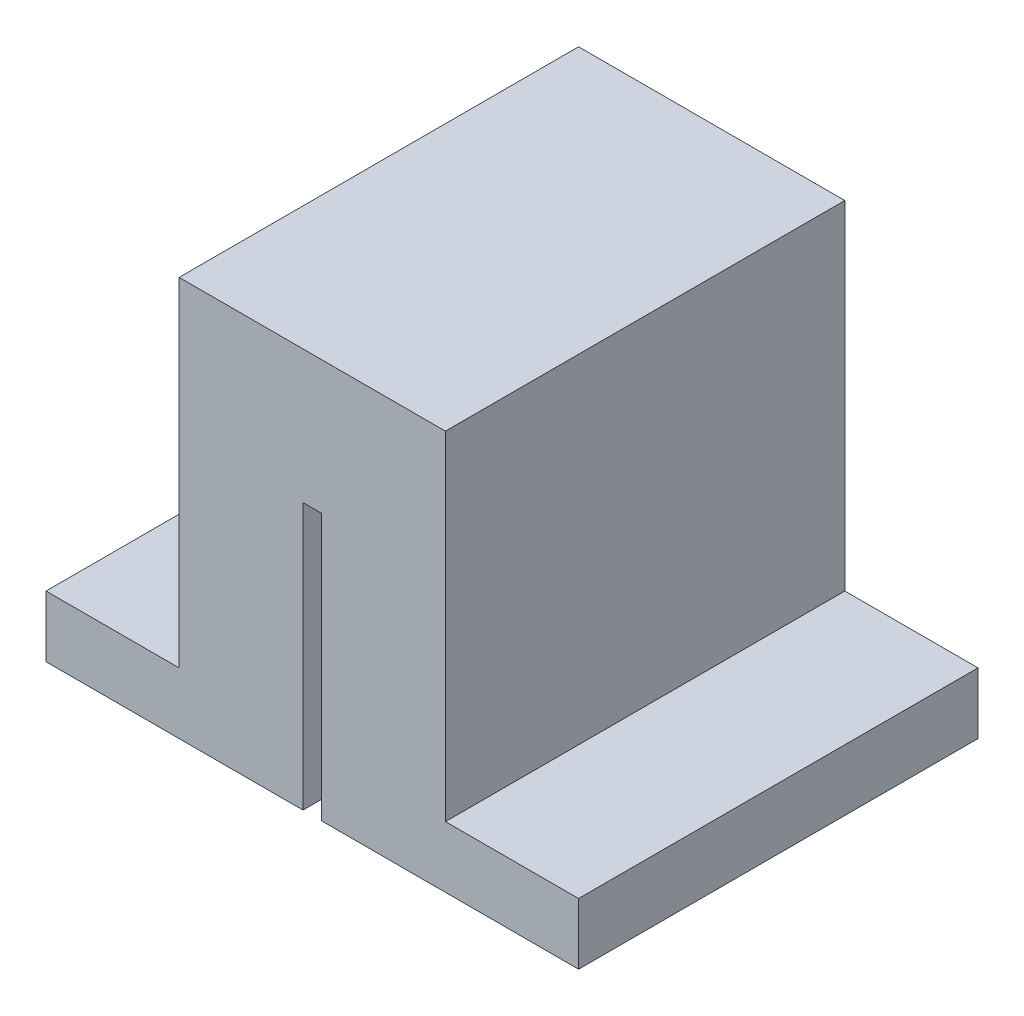
ISO-10303-21;
HEADER;
FILE_DESCRIPTION(('STEP AP214'),'2;1');
FILE_NAME('part.step','',(''),(''),'','','');
FILE_SCHEMA(('AUTOMOTIVE_DESIGN { 1 0 10303 214 1 1 1 1 }'));
ENDSEC;
DATA;
#1=APPLICATION_CONTEXT('core data for automotive mechanical design processes');
#2=APPLICATION_PROTOCOL_DEFINITION('international standard','automotive_design',2000,#1);
#3=PRODUCT_CONTEXT('',#1,'mechanical');
#4=PRODUCT('Part','Part','',(#3));
#5=PRODUCT_RELATED_PRODUCT_CATEGORY('part','',(#4));
#6=PRODUCT_DEFINITION_FORMATION('','',#4);
#7=PRODUCT_DEFINITION_CONTEXT('part definition',#1,'design');
#8=PRODUCT_DEFINITION('design','',#6,#7);
#9=PRODUCT_DEFINITION_SHAPE('','',#8);
#10=(LENGTH_UNIT() NAMED_UNIT(*) SI_UNIT(.MILLI.,.METRE.));
#11=(NAMED_UNIT(*) PLANE_ANGLE_UNIT() SI_UNIT($,.RADIAN.));
#12=(NAMED_UNIT(*) SI_UNIT($,.STERADIAN.) SOLID_ANGLE_UNIT());
#13=UNCERTAINTY_MEASURE_WITH_UNIT(LENGTH_MEASURE(1.E-05),#10,'distance_accuracy_value','');
#14=(GEOMETRIC_REPRESENTATION_CONTEXT(3) GLOBAL_UNCERTAINTY_ASSIGNED_CONTEXT((#13)) GLOBAL_UNIT_ASSIGNED_CONTEXT((#10,
#11,#12)) REPRESENTATION_CONTEXT('',''));
#15=CARTESIAN_POINT('',(0.,0.,0.));
#16=DIRECTION('',(0.,0.,1.));
#17=DIRECTION('',(1.,0.,0.));
#18=AXIS2_PLACEMENT_3D('',#15,#16,#17);
#19=CARTESIAN_POINT('',(5.,7.5,15.));
#20=DIRECTION('',(-1.,0.,0.));
#21=DIRECTION('',(0.,0.,1.));
#22=AXIS2_PLACEMENT_3D('',#19,#20,#21);
#23=PLANE('',#22);
#24=DIRECTION('',(0.,0.,1.));
#25=VECTOR('',#24,1.);
#26=CARTESIAN_POINT('',(5.,-5.2,-5.5036351623268));
#27=LINE('',#26,#25);
#28=CARTESIAN_POINT('',(5.,-5.2,0.));
#29=VERTEX_POINT('',#28);
#30=CARTESIAN_POINT('',(5.,-5.2,15.));
#31=VERTEX_POINT('',#30);
#32=EDGE_CURVE('E53',#29,#31,#27,.T.);
#33=ORIENTED_EDGE('',*,*,#32,.F.);
#34=DIRECTION('',(0.,1.,0.));
#35=VECTOR('',#34,1.);
#36=CARTESIAN_POINT('',(5.,7.5,0.));
#37=LINE('',#36,#35);
#38=CARTESIAN_POINT('',(5.,7.5,0.));
#39=VERTEX_POINT('',#38);
#40=EDGE_CURVE('E136',#29,#39,#37,.T.);
#41=ORIENTED_EDGE('',*,*,#40,.T.);
#42=DIRECTION('',(0.,0.,-1.));
#43=VECTOR('',#42,1.);
#44=CARTESIAN_POINT('',(5.,7.5,15.));
#45=LINE('',#44,#43);
#46=CARTESIAN_POINT('',(5.,7.5,15.));
#47=VERTEX_POINT('',#46);
#48=EDGE_CURVE('E11',#47,#39,#45,.T.);
#49=ORIENTED_EDGE('',*,*,#48,.F.);
#50=DIRECTION('',(0.,1.,0.));
#51=VECTOR('',#50,1.);
#52=CARTESIAN_POINT('',(5.,7.5,15.));
#53=LINE('',#52,#51);
#54=EDGE_CURVE('E199',#31,#47,#53,.T.);
#55=ORIENTED_EDGE('',*,*,#54,.F.);
#56=EDGE_LOOP('',(#33,#41,#49,#55));
#57=FACE_BOUND('',#56,.T.);
#58=ADVANCED_FACE('F39',(#57),#23,.F.);
#59=CARTESIAN_POINT('',(-5.,-7.5,15.));
#60=DIRECTION('',(0.,1.,0.));
#61=DIRECTION('',(0.,0.,1.));
#62=AXIS2_PLACEMENT_3D('',#59,#60,#61);
#63=PLANE('',#62);
#64=DIRECTION('',(1.,0.,0.));
#65=VECTOR('',#64,1.);
#66=CARTESIAN_POINT('',(-5.,-7.5,0.));
#67=LINE('',#66,#65);
#68=CARTESIAN_POINT('',(-10.,-7.5,0.));
#69=VERTEX_POINT('',#68);
#70=CARTESIAN_POINT('',(-0.35,-7.5,0.));
#71=VERTEX_POINT('',#70);
#72=EDGE_CURVE('E202',#69,#71,#67,.T.);
#73=ORIENTED_EDGE('',*,*,#72,.T.);
#74=DIRECTION('',(0.,0.,1.));
#75=VECTOR('',#74,1.);
#76=CARTESIAN_POINT('',(-0.35,-7.5,0.));
#77=LINE('',#76,#75);
#78=CARTESIAN_POINT('',(-0.35,-7.5,15.));
#79=VERTEX_POINT('',#78);
#80=EDGE_CURVE('E182',#71,#79,#77,.T.);
#81=ORIENTED_EDGE('',*,*,#80,.T.);
#82=DIRECTION('',(1.,0.,0.));
#83=VECTOR('',#82,1.);
#84=CARTESIAN_POINT('',(-5.,-7.5,15.));
#85=LINE('',#84,#83);
#86=CARTESIAN_POINT('',(-10.,-7.5,15.));
#87=VERTEX_POINT('',#86);
#88=EDGE_CURVE('E208',#87,#79,#85,.T.);
#89=ORIENTED_EDGE('',*,*,#88,.F.);
#90=DIRECTION('',(0.,0.,1.));
#91=VECTOR('',#90,1.);
#92=CARTESIAN_POINT('',(-10.,-7.5,-5.5036351623268));
#93=LINE('',#92,#91);
#94=EDGE_CURVE('E162',#69,#87,#93,.T.);
#95=ORIENTED_EDGE('',*,*,#94,.F.);
#96=EDGE_LOOP('',(#73,#81,#89,#95));
#97=FACE_BOUND('',#96,.T.);
#98=ADVANCED_FACE('F251',(#97),#63,.F.);
#99=CARTESIAN_POINT('',(-5.,7.5,15.));
#100=DIRECTION('',(0.,-1.,0.));
#101=DIRECTION('',(0.,0.,-1.));
#102=AXIS2_PLACEMENT_3D('',#99,#100,#101);
#103=PLANE('',#102);
#104=DIRECTION('',(-1.,0.,0.));
#105=VECTOR('',#104,1.);
#106=CARTESIAN_POINT('',(-5.,7.5,0.));
#107=LINE('',#106,#105);
#108=CARTESIAN_POINT('',(-5.,7.5,0.));
#109=VERTEX_POINT('',#108);
#110=EDGE_CURVE('E212',#39,#109,#107,.T.);
#111=ORIENTED_EDGE('',*,*,#110,.T.);
#112=DIRECTION('',(0.,0.,-1.));
#113=VECTOR('',#112,1.);
#114=CARTESIAN_POINT('',(-5.,7.5,15.));
#115=LINE('',#114,#113);
#116=CARTESIAN_POINT('',(-5.,7.5,15.));
#117=VERTEX_POINT('',#116);
#118=EDGE_CURVE('E46',#117,#109,#115,.T.);
#119=ORIENTED_EDGE('',*,*,#118,.F.);
#120=DIRECTION('',(-1.,0.,0.));
#121=VECTOR('',#120,1.);
#122=CARTESIAN_POINT('',(-5.,7.5,15.));
#123=LINE('',#122,#121);
#124=EDGE_CURVE('E201',#47,#117,#123,.T.);
#125=ORIENTED_EDGE('',*,*,#124,.F.);
#126=ORIENTED_EDGE('',*,*,#48,.T.);
#127=EDGE_LOOP('',(#111,#119,#125,#126));
#128=FACE_BOUND('',#127,.T.);
#129=ADVANCED_FACE('F235',(#128),#103,.F.);
#130=CARTESIAN_POINT('',(-5.,7.5,15.));
#131=DIRECTION('',(1.,0.,0.));
#132=DIRECTION('',(0.,0.,-1.));
#133=AXIS2_PLACEMENT_3D('',#130,#131,#132);
#134=PLANE('',#133);
#135=DIRECTION('',(0.,-1.,0.));
#136=VECTOR('',#135,1.);
#137=CARTESIAN_POINT('',(-5.,7.5,0.));
#138=LINE('',#137,#136);
#139=CARTESIAN_POINT('',(-5.,-5.2,0.));
#140=VERTEX_POINT('',#139);
#141=EDGE_CURVE('E214',#109,#140,#138,.T.);
#142=ORIENTED_EDGE('',*,*,#141,.T.);
#143=DIRECTION('',(0.,0.,1.));
#144=VECTOR('',#143,1.);
#145=CARTESIAN_POINT('',(-5.,-5.2,-5.5036351623268));
#146=LINE('',#145,#144);
#147=CARTESIAN_POINT('',(-5.,-5.2,15.));
#148=VERTEX_POINT('',#147);
#149=EDGE_CURVE('E167',#140,#148,#146,.T.);
#150=ORIENTED_EDGE('',*,*,#149,.T.);
#151=DIRECTION('',(0.,-1.,0.));
#152=VECTOR('',#151,1.);
#153=CARTESIAN_POINT('',(-5.,7.5,15.));
#154=LINE('',#153,#152);
#155=EDGE_CURVE('E204',#117,#148,#154,.T.);
#156=ORIENTED_EDGE('',*,*,#155,.F.);
#157=ORIENTED_EDGE('',*,*,#118,.T.);
#158=EDGE_LOOP('',(#142,#150,#156,#157));
#159=FACE_BOUND('',#158,.T.);
#160=ADVANCED_FACE('F224',(#159),#134,.F.);
#161=CARTESIAN_POINT('',(0.35,-7.5,15.));
#162=VERTEX_POINT('',#161);
#163=CARTESIAN_POINT('',(10.,-7.5,15.));
#164=VERTEX_POINT('',#163);
#165=EDGE_CURVE('E207',#162,#164,#85,.T.);
#166=ORIENTED_EDGE('',*,*,#165,.F.);
#167=DIRECTION('',(0.,0.,1.));
#168=VECTOR('',#167,1.);
#169=CARTESIAN_POINT('',(0.35,-7.5,0.));
#170=LINE('',#169,#168);
#171=CARTESIAN_POINT('',(0.35,-7.5,0.));
#172=VERTEX_POINT('',#171);
#173=EDGE_CURVE('E190',#172,#162,#170,.T.);
#174=ORIENTED_EDGE('',*,*,#173,.F.);
#175=CARTESIAN_POINT('',(10.,-7.5,0.));
#176=VERTEX_POINT('',#175);
#177=EDGE_CURVE('E217',#172,#176,#67,.T.);
#178=ORIENTED_EDGE('',*,*,#177,.T.);
#179=DIRECTION('',(0.,0.,1.));
#180=VECTOR('',#179,1.);
#181=CARTESIAN_POINT('',(10.,-7.5,-5.5036351623268));
#182=LINE('',#181,#180);
#183=EDGE_CURVE('E146',#176,#164,#182,.T.);
#184=ORIENTED_EDGE('',*,*,#183,.T.);
#185=EDGE_LOOP('',(#166,#174,#178,#184));
#186=FACE_BOUND('',#185,.T.);
#187=ADVANCED_FACE('F241',(#186),#63,.F.);
#188=CARTESIAN_POINT('',(0.,0.,15.));
#189=DIRECTION('',(0.,0.,1.));
#190=DIRECTION('',(1.,0.,0.));
#191=AXIS2_PLACEMENT_3D('',#188,#189,#190);
#192=PLANE('',#191);
#193=DIRECTION('',(0.,-1.,0.));
#194=VECTOR('',#193,1.);
#195=CARTESIAN_POINT('',(-0.35,0.,15.));
#196=LINE('',#195,#194);
#197=CARTESIAN_POINT('',(-0.35,2.5,15.));
#198=VERTEX_POINT('',#197);
#199=EDGE_CURVE('E197',#198,#79,#196,.T.);
#200=ORIENTED_EDGE('',*,*,#199,.F.);
#201=DIRECTION('',(-1.,0.,0.));
#202=VECTOR('',#201,1.);
#203=CARTESIAN_POINT('',(0.,2.5,15.));
#204=LINE('',#203,#202);
#205=CARTESIAN_POINT('',(0.35,2.5,15.));
#206=VERTEX_POINT('',#205);
#207=EDGE_CURVE('E195',#206,#198,#204,.T.);
#208=ORIENTED_EDGE('',*,*,#207,.F.);
#209=DIRECTION('',(0.,1.,0.));
#210=VECTOR('',#209,1.);
#211=CARTESIAN_POINT('',(0.35,0.,15.));
#212=LINE('',#211,#210);
#213=EDGE_CURVE('E186',#162,#206,#212,.T.);
#214=ORIENTED_EDGE('',*,*,#213,.F.);
#215=ORIENTED_EDGE('',*,*,#165,.T.);
#216=DIRECTION('',(0.,1.,0.));
#217=VECTOR('',#216,1.);
#218=CARTESIAN_POINT('',(10.,-5.2,15.));
#219=LINE('',#218,#217);
#220=CARTESIAN_POINT('',(10.,-5.2,15.));
#221=VERTEX_POINT('',#220);
#222=EDGE_CURVE('E157',#164,#221,#219,.T.);
#223=ORIENTED_EDGE('',*,*,#222,.T.);
#224=DIRECTION('',(-1.,0.,0.));
#225=VECTOR('',#224,1.);
#226=CARTESIAN_POINT('',(5.,-5.2,15.));
#227=LINE('',#226,#225);
#228=EDGE_CURVE('E151',#221,#31,#227,.T.);
#229=ORIENTED_EDGE('',*,*,#228,.T.);
#230=ORIENTED_EDGE('',*,*,#54,.T.);
#231=ORIENTED_EDGE('',*,*,#124,.T.);
#232=ORIENTED_EDGE('',*,*,#155,.T.);
#233=DIRECTION('',(-1.,0.,0.));
#234=VECTOR('',#233,1.);
#235=CARTESIAN_POINT('',(-5.,-5.2,15.));
#236=LINE('',#235,#234);
#237=CARTESIAN_POINT('',(-10.,-5.2,15.));
#238=VERTEX_POINT('',#237);
#239=EDGE_CURVE('E61',#148,#238,#236,.T.);
#240=ORIENTED_EDGE('',*,*,#239,.T.);
#241=DIRECTION('',(0.,-1.,0.));
#242=VECTOR('',#241,1.);
#243=CARTESIAN_POINT('',(-10.,-5.2,15.));
#244=LINE('',#243,#242);
#245=EDGE_CURVE('E164',#238,#87,#244,.T.);
#246=ORIENTED_EDGE('',*,*,#245,.T.);
#247=ORIENTED_EDGE('',*,*,#88,.T.);
#248=EDGE_LOOP('',(#200,#208,#214,#215,#223,#229,#230,#231,#232,#240,#246,#247));
#249=FACE_BOUND('',#248,.T.);
#250=ADVANCED_FACE('F233',(#249),#192,.T.);
#251=CARTESIAN_POINT('',(0.,0.,0.));
#252=DIRECTION('',(0.,0.,1.));
#253=DIRECTION('',(1.,0.,0.));
#254=AXIS2_PLACEMENT_3D('',#251,#252,#253);
#255=PLANE('',#254);
#256=DIRECTION('',(-1.,0.,0.));
#257=VECTOR('',#256,1.);
#258=CARTESIAN_POINT('',(-0.35,2.5,0.));
#259=LINE('',#258,#257);
#260=CARTESIAN_POINT('',(0.35,2.5,0.));
#261=VERTEX_POINT('',#260);
#262=CARTESIAN_POINT('',(-0.35,2.5,0.));
#263=VERTEX_POINT('',#262);
#264=EDGE_CURVE('E180',#261,#263,#259,.T.);
#265=ORIENTED_EDGE('',*,*,#264,.T.);
#266=DIRECTION('',(0.,-1.,0.));
#267=VECTOR('',#266,1.);
#268=CARTESIAN_POINT('',(-0.35,-7.5,0.));
#269=LINE('',#268,#267);
#270=EDGE_CURVE('E174',#263,#71,#269,.T.);
#271=ORIENTED_EDGE('',*,*,#270,.T.);
#272=ORIENTED_EDGE('',*,*,#72,.F.);
#273=DIRECTION('',(0.,1.,0.));
#274=VECTOR('',#273,1.);
#275=CARTESIAN_POINT('',(-10.,-5.2,0.));
#276=LINE('',#275,#274);
#277=CARTESIAN_POINT('',(-10.,-5.2,0.));
#278=VERTEX_POINT('',#277);
#279=EDGE_CURVE('E159',#69,#278,#276,.T.);
#280=ORIENTED_EDGE('',*,*,#279,.T.);
#281=DIRECTION('',(1.,0.,0.));
#282=VECTOR('',#281,1.);
#283=CARTESIAN_POINT('',(-5.,-5.2,0.));
#284=LINE('',#283,#282);
#285=EDGE_CURVE('E161',#278,#140,#284,.T.);
#286=ORIENTED_EDGE('',*,*,#285,.T.);
#287=ORIENTED_EDGE('',*,*,#141,.F.);
#288=ORIENTED_EDGE('',*,*,#110,.F.);
#289=ORIENTED_EDGE('',*,*,#40,.F.);
#290=DIRECTION('',(1.,0.,0.));
#291=VECTOR('',#290,1.);
#292=CARTESIAN_POINT('',(5.,-5.2,0.));
#293=LINE('',#292,#291);
#294=CARTESIAN_POINT('',(10.,-5.2,0.));
#295=VERTEX_POINT('',#294);
#296=EDGE_CURVE('E128',#29,#295,#293,.T.);
#297=ORIENTED_EDGE('',*,*,#296,.T.);
#298=DIRECTION('',(0.,-1.,0.));
#299=VECTOR('',#298,1.);
#300=CARTESIAN_POINT('',(10.,-5.2,0.));
#301=LINE('',#300,#299);
#302=EDGE_CURVE('E133',#295,#176,#301,.T.);
#303=ORIENTED_EDGE('',*,*,#302,.T.);
#304=ORIENTED_EDGE('',*,*,#177,.F.);
#305=DIRECTION('',(0.,1.,0.));
#306=VECTOR('',#305,1.);
#307=CARTESIAN_POINT('',(0.35,-7.5,0.));
#308=LINE('',#307,#306);
#309=EDGE_CURVE('E177',#172,#261,#308,.T.);
#310=ORIENTED_EDGE('',*,*,#309,.T.);
#311=EDGE_LOOP('',(#265,#271,#272,#280,#286,#287,#288,#289,#297,#303,#304,#310));
#312=FACE_BOUND('',#311,.T.);
#313=ADVANCED_FACE('F131',(#312),#255,.F.);
#314=CARTESIAN_POINT('',(-0.35,-7.5,0.));
#315=DIRECTION('',(-1.,0.,0.));
#316=DIRECTION('',(0.,0.,1.));
#317=AXIS2_PLACEMENT_3D('',#314,#315,#316);
#318=PLANE('',#317);
#319=ORIENTED_EDGE('',*,*,#199,.T.);
#320=ORIENTED_EDGE('',*,*,#80,.F.);
#321=ORIENTED_EDGE('',*,*,#270,.F.);
#322=DIRECTION('',(0.,0.,1.));
#323=VECTOR('',#322,1.);
#324=CARTESIAN_POINT('',(-0.35,2.5,0.));
#325=LINE('',#324,#323);
#326=EDGE_CURVE('E183',#263,#198,#325,.T.);
#327=ORIENTED_EDGE('',*,*,#326,.T.);
#328=EDGE_LOOP('',(#319,#320,#321,#327));
#329=FACE_BOUND('',#328,.T.);
#330=ADVANCED_FACE('F248',(#329),#318,.F.);
#331=CARTESIAN_POINT('',(-0.35,2.5,0.));
#332=DIRECTION('',(0.,1.,0.));
#333=DIRECTION('',(0.,0.,1.));
#334=AXIS2_PLACEMENT_3D('',#331,#332,#333);
#335=PLANE('',#334);
#336=ORIENTED_EDGE('',*,*,#207,.T.);
#337=ORIENTED_EDGE('',*,*,#326,.F.);
#338=ORIENTED_EDGE('',*,*,#264,.F.);
#339=DIRECTION('',(0.,0.,1.));
#340=VECTOR('',#339,1.);
#341=CARTESIAN_POINT('',(0.35,2.5,0.));
#342=LINE('',#341,#340);
#343=EDGE_CURVE('E187',#261,#206,#342,.T.);
#344=ORIENTED_EDGE('',*,*,#343,.T.);
#345=EDGE_LOOP('',(#336,#337,#338,#344));
#346=FACE_BOUND('',#345,.T.);
#347=ADVANCED_FACE('F246',(#346),#335,.F.);
#348=CARTESIAN_POINT('',(0.35,-7.5,0.));
#349=DIRECTION('',(1.,0.,0.));
#350=DIRECTION('',(0.,1.,0.));
#351=AXIS2_PLACEMENT_3D('',#348,#349,#350);
#352=PLANE('',#351);
#353=ORIENTED_EDGE('',*,*,#213,.T.);
#354=ORIENTED_EDGE('',*,*,#343,.F.);
#355=ORIENTED_EDGE('',*,*,#309,.F.);
#356=ORIENTED_EDGE('',*,*,#173,.T.);
#357=EDGE_LOOP('',(#353,#354,#355,#356));
#358=FACE_BOUND('',#357,.T.);
#359=ADVANCED_FACE('F244',(#358),#352,.F.);
#360=CARTESIAN_POINT('',(-10.,-5.2,-5.5036351623268));
#361=DIRECTION('',(-1.,0.,0.));
#362=DIRECTION('',(0.,-1.,0.));
#363=AXIS2_PLACEMENT_3D('',#360,#361,#362);
#364=PLANE('',#363);
#365=ORIENTED_EDGE('',*,*,#279,.F.);
#366=ORIENTED_EDGE('',*,*,#94,.T.);
#367=ORIENTED_EDGE('',*,*,#245,.F.);
#368=DIRECTION('',(0.,0.,1.));
#369=VECTOR('',#368,1.);
#370=CARTESIAN_POINT('',(-10.,-5.2,-5.5036351623268));
#371=LINE('',#370,#369);
#372=EDGE_CURVE('E170',#278,#238,#371,.T.);
#373=ORIENTED_EDGE('',*,*,#372,.F.);
#374=EDGE_LOOP('',(#365,#366,#367,#373));
#375=FACE_BOUND('',#374,.T.);
#376=ADVANCED_FACE('F254',(#375),#364,.T.);
#377=CARTESIAN_POINT('',(-5.,-5.2,-5.5036351623268));
#378=DIRECTION('',(0.,1.,0.));
#379=DIRECTION('',(0.,0.,1.));
#380=AXIS2_PLACEMENT_3D('',#377,#378,#379);
#381=PLANE('',#380);
#382=ORIENTED_EDGE('',*,*,#285,.F.);
#383=ORIENTED_EDGE('',*,*,#372,.T.);
#384=ORIENTED_EDGE('',*,*,#239,.F.);
#385=ORIENTED_EDGE('',*,*,#149,.F.);
#386=EDGE_LOOP('',(#382,#383,#384,#385));
#387=FACE_BOUND('',#386,.T.);
#388=ADVANCED_FACE('F230',(#387),#381,.T.);
#389=CARTESIAN_POINT('',(5.,-5.2,-5.5036351623268));
#390=DIRECTION('',(0.,1.,0.));
#391=DIRECTION('',(0.,0.,1.));
#392=AXIS2_PLACEMENT_3D('',#389,#390,#391);
#393=PLANE('',#392);
#394=ORIENTED_EDGE('',*,*,#296,.F.);
#395=ORIENTED_EDGE('',*,*,#32,.T.);
#396=ORIENTED_EDGE('',*,*,#228,.F.);
#397=DIRECTION('',(0.,0.,1.));
#398=VECTOR('',#397,1.);
#399=CARTESIAN_POINT('',(10.,-5.2,-5.5036351623268));
#400=LINE('',#399,#398);
#401=EDGE_CURVE('E143',#295,#221,#400,.T.);
#402=ORIENTED_EDGE('',*,*,#401,.F.);
#403=EDGE_LOOP('',(#394,#395,#396,#402));
#404=FACE_BOUND('',#403,.T.);
#405=ADVANCED_FACE('F149',(#404),#393,.T.);
#406=CARTESIAN_POINT('',(10.,-5.2,-5.5036351623268));
#407=DIRECTION('',(1.,0.,0.));
#408=DIRECTION('',(0.,1.,0.));
#409=AXIS2_PLACEMENT_3D('',#406,#407,#408);
#410=PLANE('',#409);
#411=ORIENTED_EDGE('',*,*,#302,.F.);
#412=ORIENTED_EDGE('',*,*,#401,.T.);
#413=ORIENTED_EDGE('',*,*,#222,.F.);
#414=ORIENTED_EDGE('',*,*,#183,.F.);
#415=EDGE_LOOP('',(#411,#412,#413,#414));
#416=FACE_BOUND('',#415,.T.);
#417=ADVANCED_FACE('F141',(#416),#410,.T.);
#418=CLOSED_SHELL('',(#58,#98,#129,#160,#187,#250,#313,#330,#347,#359,#376,#388,#405,#417));
#419=MANIFOLD_SOLID_BREP('B2',#418);
#420=ADVANCED_BREP_SHAPE_REPRESENTATION('',(#18,#419),#14);
#421=SHAPE_DEFINITION_REPRESENTATION(#9,#420);
ENDSEC;
END-ISO-10303-21;
